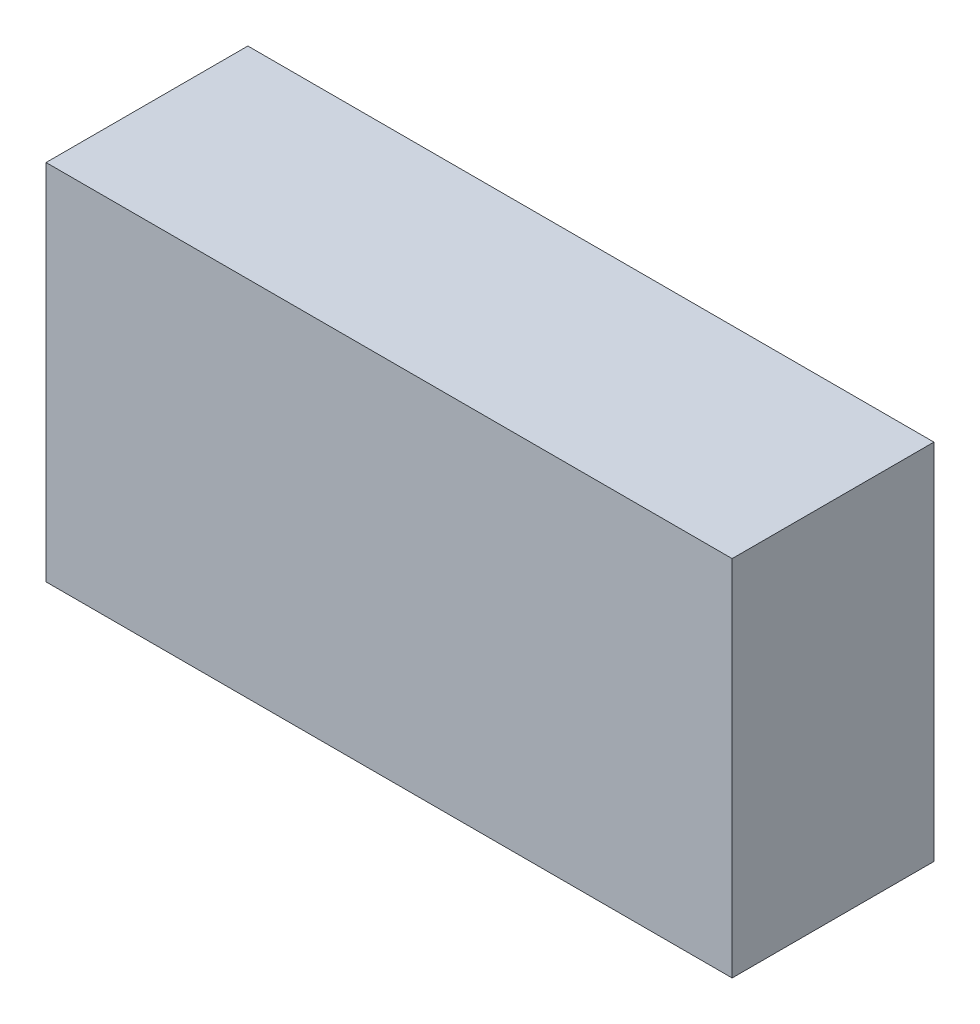
ISO-10303-21;
HEADER;
FILE_DESCRIPTION(('STEP AP214'),'2;1');
FILE_NAME('part.step','',(''),(''),'','','');
FILE_SCHEMA(('AUTOMOTIVE_DESIGN { 1 0 10303 214 1 1 1 1 }'));
ENDSEC;
DATA;
#1=APPLICATION_CONTEXT('core data for automotive mechanical design processes');
#2=APPLICATION_PROTOCOL_DEFINITION('international standard','automotive_design',2000,#1);
#3=PRODUCT_CONTEXT('',#1,'mechanical');
#4=PRODUCT('Part','Part','',(#3));
#5=PRODUCT_RELATED_PRODUCT_CATEGORY('part','',(#4));
#6=PRODUCT_DEFINITION_FORMATION('','',#4);
#7=PRODUCT_DEFINITION_CONTEXT('part definition',#1,'design');
#8=PRODUCT_DEFINITION('design','',#6,#7);
#9=PRODUCT_DEFINITION_SHAPE('','',#8);
#10=(LENGTH_UNIT() NAMED_UNIT(*) SI_UNIT(.MILLI.,.METRE.));
#11=(NAMED_UNIT(*) PLANE_ANGLE_UNIT() SI_UNIT($,.RADIAN.));
#12=(NAMED_UNIT(*) SI_UNIT($,.STERADIAN.) SOLID_ANGLE_UNIT());
#13=UNCERTAINTY_MEASURE_WITH_UNIT(LENGTH_MEASURE(1.E-05),#10,'distance_accuracy_value','');
#14=(GEOMETRIC_REPRESENTATION_CONTEXT(3) GLOBAL_UNCERTAINTY_ASSIGNED_CONTEXT((#13)) GLOBAL_UNIT_ASSIGNED_CONTEXT((#10,
#11,#12)) REPRESENTATION_CONTEXT('',''));
#15=CARTESIAN_POINT('',(0.,0.,0.));
#16=DIRECTION('',(0.,0.,1.));
#17=DIRECTION('',(1.,0.,0.));
#18=AXIS2_PLACEMENT_3D('',#15,#16,#17);
#19=CARTESIAN_POINT('',(0.,0.,0.));
#20=DIRECTION('',(0.,0.,1.));
#21=DIRECTION('',(1.,0.,0.));
#22=AXIS2_PLACEMENT_3D('',#19,#20,#21);
#23=PLANE('',#22);
#24=DIRECTION('',(0.,1.,0.));
#25=VECTOR('',#24,1.);
#26=CARTESIAN_POINT('',(-1.7,0.9,0.));
#27=LINE('',#26,#25);
#28=CARTESIAN_POINT('',(-1.7,0.9,0.));
#29=VERTEX_POINT('',#28);
#30=CARTESIAN_POINT('',(-1.7,-0.9,0.));
#31=VERTEX_POINT('',#30);
#32=EDGE_CURVE('E79',#29,#31,#27,.F.);
#33=ORIENTED_EDGE('',*,*,#32,.F.);
#34=DIRECTION('',(1.,0.,0.));
#35=VECTOR('',#34,1.);
#36=CARTESIAN_POINT('',(1.7,0.9,0.));
#37=LINE('',#36,#35);
#38=CARTESIAN_POINT('',(1.7,0.9,0.));
#39=VERTEX_POINT('',#38);
#40=EDGE_CURVE('E55',#39,#29,#37,.F.);
#41=ORIENTED_EDGE('',*,*,#40,.F.);
#42=DIRECTION('',(0.,1.,0.));
#43=VECTOR('',#42,1.);
#44=CARTESIAN_POINT('',(1.7,-0.9,0.));
#45=LINE('',#44,#43);
#46=CARTESIAN_POINT('',(1.7,-0.9,0.));
#47=VERTEX_POINT('',#46);
#48=EDGE_CURVE('E57',#47,#39,#45,.T.);
#49=ORIENTED_EDGE('',*,*,#48,.F.);
#50=DIRECTION('',(1.,0.,0.));
#51=VECTOR('',#50,1.);
#52=CARTESIAN_POINT('',(-1.7,-0.9,0.));
#53=LINE('',#52,#51);
#54=EDGE_CURVE('E20',#31,#47,#53,.T.);
#55=ORIENTED_EDGE('',*,*,#54,.F.);
#56=EDGE_LOOP('',(#33,#41,#49,#55));
#57=FACE_BOUND('',#56,.T.);
#58=ADVANCED_FACE('F17',(#57),#23,.F.);
#59=CARTESIAN_POINT('',(-1.7,-0.9,0.));
#60=DIRECTION('',(0.,-1.,0.));
#61=DIRECTION('',(0.,0.,-1.));
#62=AXIS2_PLACEMENT_3D('',#59,#60,#61);
#63=PLANE('',#62);
#64=DIRECTION('',(1.,0.,0.));
#65=VECTOR('',#64,1.);
#66=CARTESIAN_POINT('',(0.,-0.9,1.));
#67=LINE('',#66,#65);
#68=CARTESIAN_POINT('',(-1.7,-0.9,1.));
#69=VERTEX_POINT('',#68);
#70=CARTESIAN_POINT('',(1.7,-0.9,1.));
#71=VERTEX_POINT('',#70);
#72=EDGE_CURVE('E83',#69,#71,#67,.T.);
#73=ORIENTED_EDGE('',*,*,#72,.F.);
#74=DIRECTION('',(0.,0.,1.));
#75=VECTOR('',#74,1.);
#76=CARTESIAN_POINT('',(-1.7,-0.9,0.));
#77=LINE('',#76,#75);
#78=EDGE_CURVE('E68',#31,#69,#77,.T.);
#79=ORIENTED_EDGE('',*,*,#78,.F.);
#80=ORIENTED_EDGE('',*,*,#54,.T.);
#81=DIRECTION('',(0.,0.,-1.));
#82=VECTOR('',#81,1.);
#83=CARTESIAN_POINT('',(1.7,-0.9,0.));
#84=LINE('',#83,#82);
#85=EDGE_CURVE('E63',#71,#47,#84,.T.);
#86=ORIENTED_EDGE('',*,*,#85,.F.);
#87=EDGE_LOOP('',(#73,#79,#80,#86));
#88=FACE_BOUND('',#87,.T.);
#89=ADVANCED_FACE('F65',(#88),#63,.T.);
#90=CARTESIAN_POINT('',(1.7,-0.9,0.));
#91=DIRECTION('',(1.,0.,0.));
#92=DIRECTION('',(0.,0.,-1.));
#93=AXIS2_PLACEMENT_3D('',#90,#91,#92);
#94=PLANE('',#93);
#95=DIRECTION('',(0.,1.,0.));
#96=VECTOR('',#95,1.);
#97=CARTESIAN_POINT('',(1.7,0.,1.));
#98=LINE('',#97,#96);
#99=CARTESIAN_POINT('',(1.7,0.9,1.));
#100=VERTEX_POINT('',#99);
#101=EDGE_CURVE('E72',#71,#100,#98,.T.);
#102=ORIENTED_EDGE('',*,*,#101,.F.);
#103=ORIENTED_EDGE('',*,*,#85,.T.);
#104=ORIENTED_EDGE('',*,*,#48,.T.);
#105=DIRECTION('',(0.,0.,1.));
#106=VECTOR('',#105,1.);
#107=CARTESIAN_POINT('',(1.7,0.9,0.));
#108=LINE('',#107,#106);
#109=EDGE_CURVE('E75',#100,#39,#108,.F.);
#110=ORIENTED_EDGE('',*,*,#109,.F.);
#111=EDGE_LOOP('',(#102,#103,#104,#110));
#112=FACE_BOUND('',#111,.T.);
#113=ADVANCED_FACE('F70',(#112),#94,.T.);
#114=CARTESIAN_POINT('',(1.7,0.9,0.));
#115=DIRECTION('',(0.,1.,0.));
#116=DIRECTION('',(0.,0.,1.));
#117=AXIS2_PLACEMENT_3D('',#114,#115,#116);
#118=PLANE('',#117);
#119=DIRECTION('',(1.,0.,0.));
#120=VECTOR('',#119,1.);
#121=CARTESIAN_POINT('',(0.,0.9,1.));
#122=LINE('',#121,#120);
#123=CARTESIAN_POINT('',(-1.7,0.9,1.));
#124=VERTEX_POINT('',#123);
#125=EDGE_CURVE('E26',#100,#124,#122,.F.);
#126=ORIENTED_EDGE('',*,*,#125,.F.);
#127=ORIENTED_EDGE('',*,*,#109,.T.);
#128=ORIENTED_EDGE('',*,*,#40,.T.);
#129=DIRECTION('',(0.,0.,1.));
#130=VECTOR('',#129,1.);
#131=CARTESIAN_POINT('',(-1.7,0.9,0.));
#132=LINE('',#131,#130);
#133=EDGE_CURVE('E35',#124,#29,#132,.F.);
#134=ORIENTED_EDGE('',*,*,#133,.F.);
#135=EDGE_LOOP('',(#126,#127,#128,#134));
#136=FACE_BOUND('',#135,.T.);
#137=ADVANCED_FACE('F89',(#136),#118,.T.);
#138=CARTESIAN_POINT('',(-1.7,0.9,0.));
#139=DIRECTION('',(-1.,0.,0.));
#140=DIRECTION('',(0.,0.,1.));
#141=AXIS2_PLACEMENT_3D('',#138,#139,#140);
#142=PLANE('',#141);
#143=DIRECTION('',(0.,1.,0.));
#144=VECTOR('',#143,1.);
#145=CARTESIAN_POINT('',(-1.7,0.,1.));
#146=LINE('',#145,#144);
#147=EDGE_CURVE('E11',#124,#69,#146,.F.);
#148=ORIENTED_EDGE('',*,*,#147,.F.);
#149=ORIENTED_EDGE('',*,*,#133,.T.);
#150=ORIENTED_EDGE('',*,*,#32,.T.);
#151=ORIENTED_EDGE('',*,*,#78,.T.);
#152=EDGE_LOOP('',(#148,#149,#150,#151));
#153=FACE_BOUND('',#152,.T.);
#154=ADVANCED_FACE('F91',(#153),#142,.T.);
#155=CARTESIAN_POINT('',(0.,0.,1.));
#156=DIRECTION('',(0.,0.,1.));
#157=DIRECTION('',(1.,0.,0.));
#158=AXIS2_PLACEMENT_3D('',#155,#156,#157);
#159=PLANE('',#158);
#160=ORIENTED_EDGE('',*,*,#125,.T.);
#161=ORIENTED_EDGE('',*,*,#147,.T.);
#162=ORIENTED_EDGE('',*,*,#72,.T.);
#163=ORIENTED_EDGE('',*,*,#101,.T.);
#164=EDGE_LOOP('',(#160,#161,#162,#163));
#165=FACE_BOUND('',#164,.T.);
#166=ADVANCED_FACE('F88',(#165),#159,.T.);
#167=CLOSED_SHELL('',(#58,#89,#113,#137,#154,#166));
#168=MANIFOLD_SOLID_BREP('B1',#167);
#169=ADVANCED_BREP_SHAPE_REPRESENTATION('',(#18,#168),#14);
#170=SHAPE_DEFINITION_REPRESENTATION(#9,#169);
ENDSEC;
END-ISO-10303-21;
